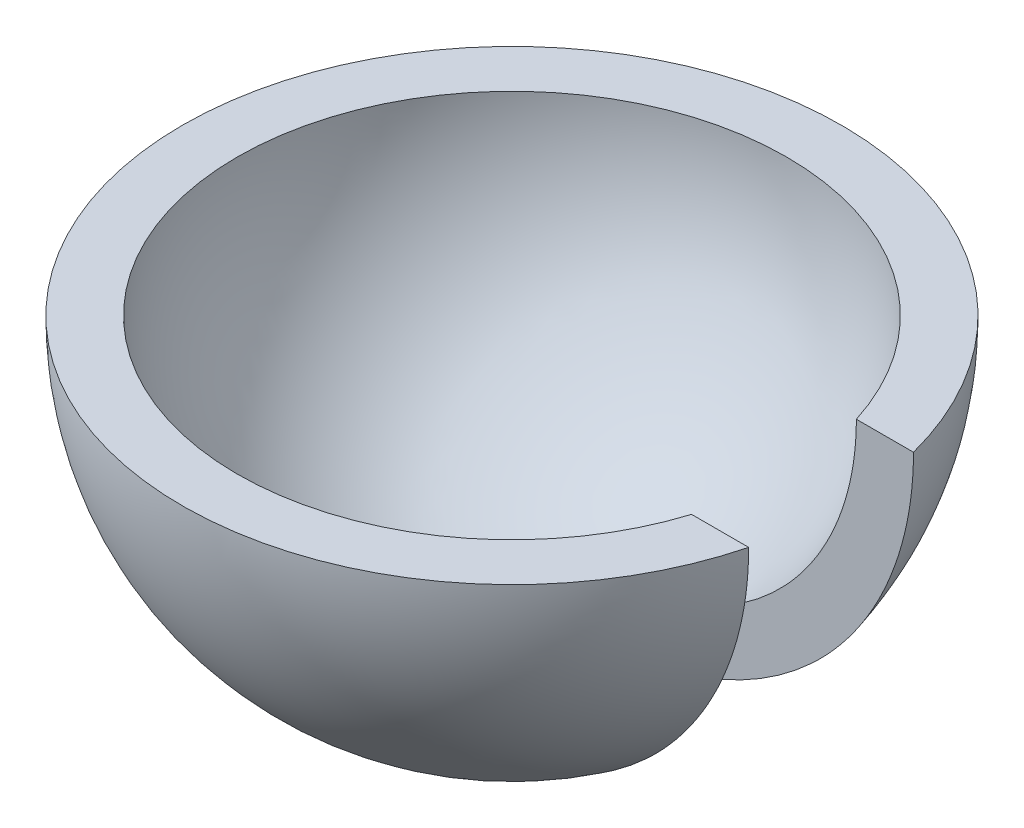
ISO-10303-21;
HEADER;
FILE_DESCRIPTION(('STEP AP214'),'2;1');
FILE_NAME('part.step','',(''),(''),'','','');
FILE_SCHEMA(('AUTOMOTIVE_DESIGN { 1 0 10303 214 1 1 1 1 }'));
ENDSEC;
DATA;
#1=APPLICATION_CONTEXT('core data for automotive mechanical design processes');
#2=APPLICATION_PROTOCOL_DEFINITION('international standard','automotive_design',2000,#1);
#3=PRODUCT_CONTEXT('',#1,'mechanical');
#4=PRODUCT('Part','Part','',(#3));
#5=PRODUCT_RELATED_PRODUCT_CATEGORY('part','',(#4));
#6=PRODUCT_DEFINITION_FORMATION('','',#4);
#7=PRODUCT_DEFINITION_CONTEXT('part definition',#1,'design');
#8=PRODUCT_DEFINITION('design','',#6,#7);
#9=PRODUCT_DEFINITION_SHAPE('','',#8);
#10=(LENGTH_UNIT() NAMED_UNIT(*) SI_UNIT(.MILLI.,.METRE.));
#11=(NAMED_UNIT(*) PLANE_ANGLE_UNIT() SI_UNIT($,.RADIAN.));
#12=(NAMED_UNIT(*) SI_UNIT($,.STERADIAN.) SOLID_ANGLE_UNIT());
#13=UNCERTAINTY_MEASURE_WITH_UNIT(LENGTH_MEASURE(1.E-05),#10,'distance_accuracy_value','');
#14=(GEOMETRIC_REPRESENTATION_CONTEXT(3) GLOBAL_UNCERTAINTY_ASSIGNED_CONTEXT((#13)) GLOBAL_UNIT_ASSIGNED_CONTEXT((#10,
#11,#12)) REPRESENTATION_CONTEXT('',''));
#15=CARTESIAN_POINT('',(0.,0.,0.));
#16=DIRECTION('',(0.,0.,1.));
#17=DIRECTION('',(1.,0.,0.));
#18=AXIS2_PLACEMENT_3D('',#15,#16,#17);
#19=CARTESIAN_POINT('',(0.,0.,0.));
#20=DIRECTION('',(1.,0.,0.));
#21=DIRECTION('',(0.,0.,1.));
#22=AXIS2_PLACEMENT_3D('',#19,#20,#21);
#23=SPHERICAL_SURFACE('',#22,5.);
#24=CARTESIAN_POINT('',(0.,0.,-1.5));
#25=DIRECTION('',(0.,0.,-1.));
#26=DIRECTION('',(0.,1.,0.));
#27=AXIS2_PLACEMENT_3D('',#24,#25,#26);
#28=CIRCLE('',#27,4.76969600708473);
#29=CARTESIAN_POINT('',(4.76969600708473,0.,-1.5));
#30=VERTEX_POINT('',#29);
#31=CARTESIAN_POINT('',(0.,-4.76969600708474,-1.49999999999996));
#32=VERTEX_POINT('',#31);
#33=EDGE_CURVE('E63',#30,#32,#28,.T.);
#34=ORIENTED_EDGE('',*,*,#33,.F.);
#35=CARTESIAN_POINT('',(0.,0.,0.));
#36=DIRECTION('',(0.,1.,0.));
#37=DIRECTION('',(0.,0.,-1.));
#38=AXIS2_PLACEMENT_3D('',#35,#36,#37);
#39=CIRCLE('',#38,5.);
#40=CARTESIAN_POINT('',(4.76969600708473,0.,1.5));
#41=VERTEX_POINT('',#40);
#42=EDGE_CURVE('E101',#30,#41,#39,.T.);
#43=ORIENTED_EDGE('',*,*,#42,.T.);
#44=CARTESIAN_POINT('',(0.,0.,1.5));
#45=DIRECTION('',(0.,0.,1.));
#46=DIRECTION('',(0.,-1.,0.));
#47=AXIS2_PLACEMENT_3D('',#44,#45,#46);
#48=CIRCLE('',#47,4.76969600708473);
#49=CARTESIAN_POINT('',(0.,-4.76969600708472,1.50000000000003));
#50=VERTEX_POINT('',#49);
#51=EDGE_CURVE('E55',#50,#41,#48,.T.);
#52=ORIENTED_EDGE('',*,*,#51,.F.);
#53=CARTESIAN_POINT('',(0.,0.,0.));
#54=DIRECTION('',(-1.,0.,0.));
#55=DIRECTION('',(0.,0.,1.));
#56=AXIS2_PLACEMENT_3D('',#53,#54,#55);
#57=CIRCLE('',#56,5.);
#58=EDGE_CURVE('E104',#32,#50,#57,.T.);
#59=ORIENTED_EDGE('',*,*,#58,.F.);
#60=EDGE_LOOP('',(#34,#43,#52,#59));
#61=FACE_BOUND('',#60,.T.);
#62=ADVANCED_FACE('F39',(#61),#23,.F.);
#63=CARTESIAN_POINT('',(0.,0.,0.));
#64=DIRECTION('',(1.,0.,0.));
#65=DIRECTION('',(0.,0.,-1.));
#66=AXIS2_PLACEMENT_3D('',#63,#64,#65);
#67=SPHERICAL_SURFACE('',#66,6.);
#68=CARTESIAN_POINT('',(0.,0.,-1.5));
#69=DIRECTION('',(0.,0.,-1.));
#70=DIRECTION('',(0.,1.,0.));
#71=AXIS2_PLACEMENT_3D('',#68,#69,#70);
#72=CIRCLE('',#71,5.80947501931113);
#73=CARTESIAN_POINT('',(0.,-5.80947501931114,-1.49999999999996));
#74=VERTEX_POINT('',#73);
#75=CARTESIAN_POINT('',(5.80947501931112,0.,-1.5));
#76=VERTEX_POINT('',#75);
#77=EDGE_CURVE('E112',#74,#76,#72,.F.);
#78=ORIENTED_EDGE('',*,*,#77,.F.);
#79=CARTESIAN_POINT('',(0.,0.,0.));
#80=DIRECTION('',(-1.,0.,0.));
#81=DIRECTION('',(0.,0.,1.));
#82=AXIS2_PLACEMENT_3D('',#79,#80,#81);
#83=CIRCLE('',#82,6.);
#84=CARTESIAN_POINT('',(0.,-5.80947501931112,1.50000000000004));
#85=VERTEX_POINT('',#84);
#86=EDGE_CURVE('E11',#85,#74,#83,.F.);
#87=ORIENTED_EDGE('',*,*,#86,.F.);
#88=CARTESIAN_POINT('',(0.,0.,1.5));
#89=DIRECTION('',(0.,0.,1.));
#90=DIRECTION('',(0.,-1.,0.));
#91=AXIS2_PLACEMENT_3D('',#88,#89,#90);
#92=CIRCLE('',#91,5.80947501931113);
#93=CARTESIAN_POINT('',(5.80947501931113,0.,1.5));
#94=VERTEX_POINT('',#93);
#95=EDGE_CURVE('E82',#94,#85,#92,.F.);
#96=ORIENTED_EDGE('',*,*,#95,.F.);
#97=CARTESIAN_POINT('',(0.,0.,0.));
#98=DIRECTION('',(0.,-1.,0.));
#99=DIRECTION('',(0.,0.,-1.));
#100=AXIS2_PLACEMENT_3D('',#97,#98,#99);
#101=CIRCLE('',#100,6.);
#102=EDGE_CURVE('E89',#94,#76,#101,.T.);
#103=ORIENTED_EDGE('',*,*,#102,.T.);
#104=EDGE_LOOP('',(#78,#87,#96,#103));
#105=FACE_BOUND('',#104,.T.);
#106=ADVANCED_FACE('F41',(#105),#67,.T.);
#107=CARTESIAN_POINT('',(0.,0.,0.));
#108=DIRECTION('',(0.,-1.,0.));
#109=DIRECTION('',(0.,0.,-1.));
#110=AXIS2_PLACEMENT_3D('',#107,#108,#109);
#111=PLANE('',#110);
#112=ORIENTED_EDGE('',*,*,#42,.F.);
#113=DIRECTION('',(1.,0.,0.));
#114=VECTOR('',#113,1.);
#115=CARTESIAN_POINT('',(0.,0.,-1.5));
#116=LINE('',#115,#114);
#117=EDGE_CURVE('E48',#30,#76,#116,.T.);
#118=ORIENTED_EDGE('',*,*,#117,.T.);
#119=ORIENTED_EDGE('',*,*,#102,.F.);
#120=DIRECTION('',(-1.,0.,0.));
#121=VECTOR('',#120,1.);
#122=CARTESIAN_POINT('',(0.,0.,1.5));
#123=LINE('',#122,#121);
#124=EDGE_CURVE('E79',#94,#41,#123,.T.);
#125=ORIENTED_EDGE('',*,*,#124,.T.);
#126=EDGE_LOOP('',(#112,#118,#119,#125));
#127=FACE_BOUND('',#126,.T.);
#128=ADVANCED_FACE('F99',(#127),#111,.F.);
#129=CARTESIAN_POINT('',(0.,-6.00000000000005,-1.49999999999996));
#130=DIRECTION('',(-1.,0.,0.));
#131=DIRECTION('',(0.,0.,1.));
#132=AXIS2_PLACEMENT_3D('',#129,#130,#131);
#133=PLANE('',#132);
#134=ORIENTED_EDGE('',*,*,#58,.T.);
#135=DIRECTION('',(0.,1.,0.));
#136=VECTOR('',#135,1.);
#137=CARTESIAN_POINT('',(0.,-6.00000000000003,1.50000000000004));
#138=LINE('',#137,#136);
#139=EDGE_CURVE('E117',#85,#50,#138,.T.);
#140=ORIENTED_EDGE('',*,*,#139,.F.);
#141=ORIENTED_EDGE('',*,*,#86,.T.);
#142=DIRECTION('',(0.,1.,0.));
#143=VECTOR('',#142,1.);
#144=CARTESIAN_POINT('',(0.,-6.00000000000005,-1.49999999999996));
#145=LINE('',#144,#143);
#146=EDGE_CURVE('E96',#74,#32,#145,.T.);
#147=ORIENTED_EDGE('',*,*,#146,.T.);
#148=EDGE_LOOP('',(#134,#140,#141,#147));
#149=FACE_BOUND('',#148,.T.);
#150=ADVANCED_FACE('F123',(#149),#133,.F.);
#151=CARTESIAN_POINT('',(0.,-6.00000000000005,-1.49999999999996));
#152=DIRECTION('',(0.,0.,-1.));
#153=DIRECTION('',(0.,1.,0.));
#154=AXIS2_PLACEMENT_3D('',#151,#152,#153);
#155=PLANE('',#154);
#156=ORIENTED_EDGE('',*,*,#33,.T.);
#157=ORIENTED_EDGE('',*,*,#146,.F.);
#158=ORIENTED_EDGE('',*,*,#77,.T.);
#159=ORIENTED_EDGE('',*,*,#117,.F.);
#160=EDGE_LOOP('',(#156,#157,#158,#159));
#161=FACE_BOUND('',#160,.T.);
#162=ADVANCED_FACE('F134',(#161),#155,.F.);
#163=CARTESIAN_POINT('',(0.,-6.00000000000003,1.50000000000004));
#164=DIRECTION('',(0.,0.,1.));
#165=DIRECTION('',(0.,-1.,0.));
#166=AXIS2_PLACEMENT_3D('',#163,#164,#165);
#167=PLANE('',#166);
#168=ORIENTED_EDGE('',*,*,#51,.T.);
#169=ORIENTED_EDGE('',*,*,#124,.F.);
#170=ORIENTED_EDGE('',*,*,#95,.T.);
#171=ORIENTED_EDGE('',*,*,#139,.T.);
#172=EDGE_LOOP('',(#168,#169,#170,#171));
#173=FACE_BOUND('',#172,.T.);
#174=ADVANCED_FACE('F81',(#173),#167,.F.);
#175=CLOSED_SHELL('',(#62,#106,#128,#150,#162,#174));
#176=MANIFOLD_SOLID_BREP('B2',#175);
#177=ADVANCED_BREP_SHAPE_REPRESENTATION('',(#18,#176),#14);
#178=SHAPE_DEFINITION_REPRESENTATION(#9,#177);
ENDSEC;
END-ISO-10303-21;
